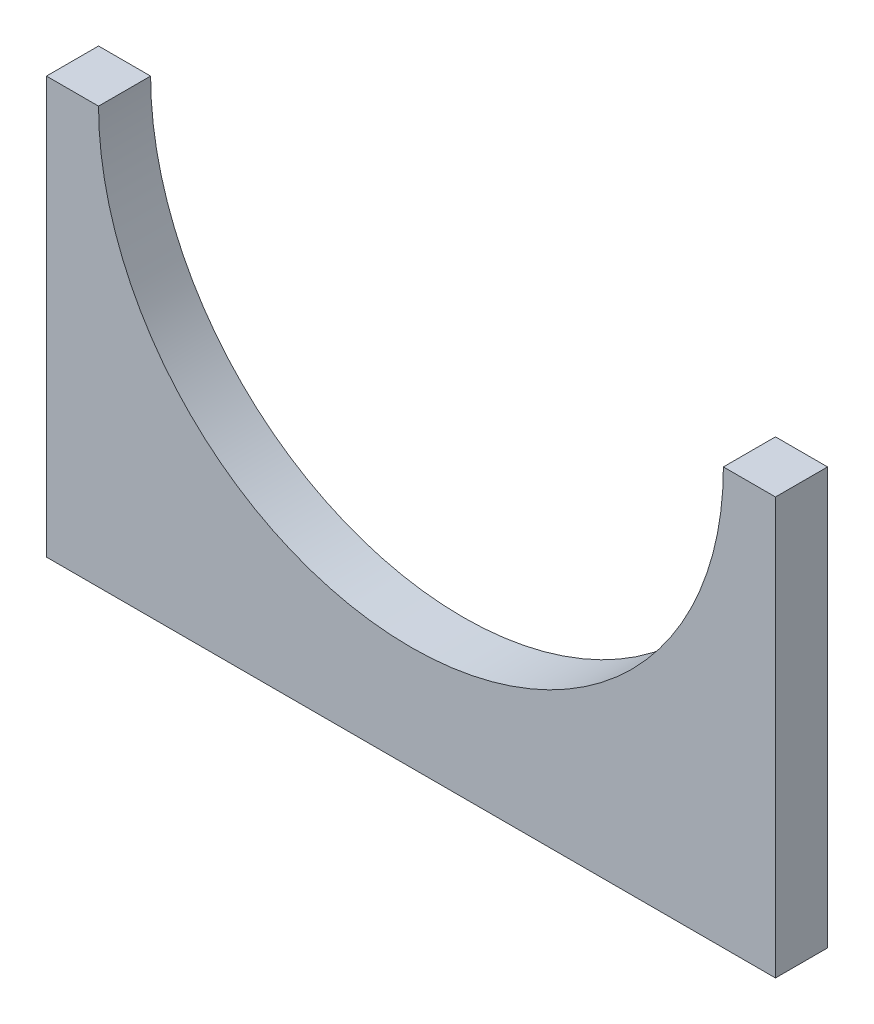
ISO-10303-21;
HEADER;
FILE_DESCRIPTION(('STEP AP214'),'2;1');
FILE_NAME('part.step','',(''),(''),'','','');
FILE_SCHEMA(('AUTOMOTIVE_DESIGN { 1 0 10303 214 1 1 1 1 }'));
ENDSEC;
DATA;
#1=APPLICATION_CONTEXT('core data for automotive mechanical design processes');
#2=APPLICATION_PROTOCOL_DEFINITION('international standard','automotive_design',2000,#1);
#3=PRODUCT_CONTEXT('',#1,'mechanical');
#4=PRODUCT('Part','Part','',(#3));
#5=PRODUCT_RELATED_PRODUCT_CATEGORY('part','',(#4));
#6=PRODUCT_DEFINITION_FORMATION('','',#4);
#7=PRODUCT_DEFINITION_CONTEXT('part definition',#1,'design');
#8=PRODUCT_DEFINITION('design','',#6,#7);
#9=PRODUCT_DEFINITION_SHAPE('','',#8);
#10=(LENGTH_UNIT() NAMED_UNIT(*) SI_UNIT(.MILLI.,.METRE.));
#11=(NAMED_UNIT(*) PLANE_ANGLE_UNIT() SI_UNIT($,.RADIAN.));
#12=(NAMED_UNIT(*) SI_UNIT($,.STERADIAN.) SOLID_ANGLE_UNIT());
#13=UNCERTAINTY_MEASURE_WITH_UNIT(LENGTH_MEASURE(1.E-05),#10,'distance_accuracy_value','');
#14=(GEOMETRIC_REPRESENTATION_CONTEXT(3) GLOBAL_UNCERTAINTY_ASSIGNED_CONTEXT((#13)) GLOBAL_UNIT_ASSIGNED_CONTEXT((#10,
#11,#12)) REPRESENTATION_CONTEXT('',''));
#15=CARTESIAN_POINT('',(0.,0.,0.));
#16=DIRECTION('',(0.,0.,1.));
#17=DIRECTION('',(1.,0.,0.));
#18=AXIS2_PLACEMENT_3D('',#15,#16,#17);
#19=CARTESIAN_POINT('',(-35.,0.,2.5));
#20=DIRECTION('',(0.,-1.,0.));
#21=DIRECTION('',(0.,0.,-1.));
#22=AXIS2_PLACEMENT_3D('',#19,#20,#21);
#23=PLANE('',#22);
#24=DIRECTION('',(-1.,0.,0.));
#25=VECTOR('',#24,1.);
#26=CARTESIAN_POINT('',(-35.,0.,-2.5));
#27=LINE('',#26,#25);
#28=CARTESIAN_POINT('',(-30.,0.,-2.5));
#29=VERTEX_POINT('',#28);
#30=CARTESIAN_POINT('',(-35.,0.,-2.5));
#31=VERTEX_POINT('',#30);
#32=EDGE_CURVE('E117',#29,#31,#27,.T.);
#33=ORIENTED_EDGE('',*,*,#32,.T.);
#34=DIRECTION('',(0.,0.,-1.));
#35=VECTOR('',#34,1.);
#36=CARTESIAN_POINT('',(-35.,0.,2.5));
#37=LINE('',#36,#35);
#38=CARTESIAN_POINT('',(-35.,0.,2.5));
#39=VERTEX_POINT('',#38);
#40=EDGE_CURVE('E11',#39,#31,#37,.T.);
#41=ORIENTED_EDGE('',*,*,#40,.F.);
#42=DIRECTION('',(-1.,0.,0.));
#43=VECTOR('',#42,1.);
#44=CARTESIAN_POINT('',(-35.,0.,2.5));
#45=LINE('',#44,#43);
#46=CARTESIAN_POINT('',(-30.,0.,2.5));
#47=VERTEX_POINT('',#46);
#48=EDGE_CURVE('E127',#47,#39,#45,.T.);
#49=ORIENTED_EDGE('',*,*,#48,.F.);
#50=DIRECTION('',(0.,0.,-1.));
#51=VECTOR('',#50,1.);
#52=CARTESIAN_POINT('',(-30.,0.,2.5));
#53=LINE('',#52,#51);
#54=EDGE_CURVE('E113',#47,#29,#53,.T.);
#55=ORIENTED_EDGE('',*,*,#54,.T.);
#56=EDGE_LOOP('',(#33,#41,#49,#55));
#57=FACE_BOUND('',#56,.T.);
#58=ADVANCED_FACE('F33',(#57),#23,.F.);
#59=CARTESIAN_POINT('',(-35.,0.,2.5));
#60=DIRECTION('',(1.,0.,0.));
#61=DIRECTION('',(0.,1.,0.));
#62=AXIS2_PLACEMENT_3D('',#59,#60,#61);
#63=PLANE('',#62);
#64=DIRECTION('',(0.,-1.,0.));
#65=VECTOR('',#64,1.);
#66=CARTESIAN_POINT('',(-35.,0.,-2.5));
#67=LINE('',#66,#65);
#68=CARTESIAN_POINT('',(-35.,-40.,-2.5));
#69=VERTEX_POINT('',#68);
#70=EDGE_CURVE('E120',#31,#69,#67,.T.);
#71=ORIENTED_EDGE('',*,*,#70,.T.);
#72=DIRECTION('',(0.,0.,-1.));
#73=VECTOR('',#72,1.);
#74=CARTESIAN_POINT('',(-35.,-40.,2.5));
#75=LINE('',#74,#73);
#76=CARTESIAN_POINT('',(-35.,-40.,2.5));
#77=VERTEX_POINT('',#76);
#78=EDGE_CURVE('E41',#77,#69,#75,.T.);
#79=ORIENTED_EDGE('',*,*,#78,.F.);
#80=DIRECTION('',(0.,-1.,0.));
#81=VECTOR('',#80,1.);
#82=CARTESIAN_POINT('',(-35.,0.,2.5));
#83=LINE('',#82,#81);
#84=EDGE_CURVE('E86',#39,#77,#83,.T.);
#85=ORIENTED_EDGE('',*,*,#84,.F.);
#86=ORIENTED_EDGE('',*,*,#40,.T.);
#87=EDGE_LOOP('',(#71,#79,#85,#86));
#88=FACE_BOUND('',#87,.T.);
#89=ADVANCED_FACE('F151',(#88),#63,.F.);
#90=CARTESIAN_POINT('',(-35.,-40.,2.5));
#91=DIRECTION('',(0.,1.,0.));
#92=DIRECTION('',(0.,0.,1.));
#93=AXIS2_PLACEMENT_3D('',#90,#91,#92);
#94=PLANE('',#93);
#95=DIRECTION('',(1.,0.,0.));
#96=VECTOR('',#95,1.);
#97=CARTESIAN_POINT('',(-35.,-40.,-2.5));
#98=LINE('',#97,#96);
#99=CARTESIAN_POINT('',(35.,-40.,-2.5));
#100=VERTEX_POINT('',#99);
#101=EDGE_CURVE('E122',#69,#100,#98,.T.);
#102=ORIENTED_EDGE('',*,*,#101,.T.);
#103=DIRECTION('',(0.,0.,-1.));
#104=VECTOR('',#103,1.);
#105=CARTESIAN_POINT('',(35.,-40.,2.5));
#106=LINE('',#105,#104);
#107=CARTESIAN_POINT('',(35.,-40.,2.5));
#108=VERTEX_POINT('',#107);
#109=EDGE_CURVE('E108',#108,#100,#106,.T.);
#110=ORIENTED_EDGE('',*,*,#109,.F.);
#111=DIRECTION('',(1.,0.,0.));
#112=VECTOR('',#111,1.);
#113=CARTESIAN_POINT('',(-35.,-40.,2.5));
#114=LINE('',#113,#112);
#115=EDGE_CURVE('E99',#77,#108,#114,.T.);
#116=ORIENTED_EDGE('',*,*,#115,.F.);
#117=ORIENTED_EDGE('',*,*,#78,.T.);
#118=EDGE_LOOP('',(#102,#110,#116,#117));
#119=FACE_BOUND('',#118,.T.);
#120=ADVANCED_FACE('F133',(#119),#94,.F.);
#121=CARTESIAN_POINT('',(35.,-40.,2.5));
#122=DIRECTION('',(-1.,0.,0.));
#123=DIRECTION('',(0.,-1.,0.));
#124=AXIS2_PLACEMENT_3D('',#121,#122,#123);
#125=PLANE('',#124);
#126=DIRECTION('',(0.,1.,0.));
#127=VECTOR('',#126,1.);
#128=CARTESIAN_POINT('',(35.,-40.,-2.5));
#129=LINE('',#128,#127);
#130=CARTESIAN_POINT('',(35.,0.,-2.5));
#131=VERTEX_POINT('',#130);
#132=EDGE_CURVE('E107',#100,#131,#129,.T.);
#133=ORIENTED_EDGE('',*,*,#132,.T.);
#134=DIRECTION('',(0.,0.,-1.));
#135=VECTOR('',#134,1.);
#136=CARTESIAN_POINT('',(35.,0.,2.5));
#137=LINE('',#136,#135);
#138=CARTESIAN_POINT('',(35.,0.,2.5));
#139=VERTEX_POINT('',#138);
#140=EDGE_CURVE('E104',#139,#131,#137,.T.);
#141=ORIENTED_EDGE('',*,*,#140,.F.);
#142=DIRECTION('',(0.,1.,0.));
#143=VECTOR('',#142,1.);
#144=CARTESIAN_POINT('',(35.,-40.,2.5));
#145=LINE('',#144,#143);
#146=EDGE_CURVE('E93',#108,#139,#145,.T.);
#147=ORIENTED_EDGE('',*,*,#146,.F.);
#148=ORIENTED_EDGE('',*,*,#109,.T.);
#149=EDGE_LOOP('',(#133,#141,#147,#148));
#150=FACE_BOUND('',#149,.T.);
#151=ADVANCED_FACE('F105',(#150),#125,.F.);
#152=CARTESIAN_POINT('',(30.,0.,2.5));
#153=DIRECTION('',(0.,-1.,0.));
#154=DIRECTION('',(0.,0.,-1.));
#155=AXIS2_PLACEMENT_3D('',#152,#153,#154);
#156=PLANE('',#155);
#157=DIRECTION('',(-1.,0.,0.));
#158=VECTOR('',#157,1.);
#159=CARTESIAN_POINT('',(30.,0.,-2.5));
#160=LINE('',#159,#158);
#161=CARTESIAN_POINT('',(30.,0.,-2.5));
#162=VERTEX_POINT('',#161);
#163=EDGE_CURVE('E72',#131,#162,#160,.T.);
#164=ORIENTED_EDGE('',*,*,#163,.T.);
#165=DIRECTION('',(0.,0.,-1.));
#166=VECTOR('',#165,1.);
#167=CARTESIAN_POINT('',(30.,0.,2.5));
#168=LINE('',#167,#166);
#169=CARTESIAN_POINT('',(30.,0.,2.5));
#170=VERTEX_POINT('',#169);
#171=EDGE_CURVE('E109',#170,#162,#168,.T.);
#172=ORIENTED_EDGE('',*,*,#171,.F.);
#173=DIRECTION('',(-1.,0.,0.));
#174=VECTOR('',#173,1.);
#175=CARTESIAN_POINT('',(30.,0.,2.5));
#176=LINE('',#175,#174);
#177=EDGE_CURVE('E97',#139,#170,#176,.T.);
#178=ORIENTED_EDGE('',*,*,#177,.F.);
#179=ORIENTED_EDGE('',*,*,#140,.T.);
#180=EDGE_LOOP('',(#164,#172,#178,#179));
#181=FACE_BOUND('',#180,.T.);
#182=ADVANCED_FACE('F111',(#181),#156,.F.);
#183=CARTESIAN_POINT('',(0.,0.,2.5));
#184=DIRECTION('',(0.,0.,-1.));
#185=DIRECTION('',(-1.,0.,0.));
#186=AXIS2_PLACEMENT_3D('',#183,#184,#185);
#187=CYLINDRICAL_SURFACE('',#186,30.);
#188=CARTESIAN_POINT('',(0.,0.,-2.5));
#189=DIRECTION('',(0.,0.,-1.));
#190=DIRECTION('',(1.,0.,0.));
#191=AXIS2_PLACEMENT_3D('',#188,#189,#190);
#192=CIRCLE('',#191,30.);
#193=EDGE_CURVE('E78',#162,#29,#192,.T.);
#194=ORIENTED_EDGE('',*,*,#193,.T.);
#195=ORIENTED_EDGE('',*,*,#54,.F.);
#196=CARTESIAN_POINT('',(0.,0.,2.5));
#197=DIRECTION('',(0.,0.,-1.));
#198=DIRECTION('',(1.,0.,0.));
#199=AXIS2_PLACEMENT_3D('',#196,#197,#198);
#200=CIRCLE('',#199,30.);
#201=EDGE_CURVE('E49',#170,#47,#200,.T.);
#202=ORIENTED_EDGE('',*,*,#201,.F.);
#203=ORIENTED_EDGE('',*,*,#171,.T.);
#204=EDGE_LOOP('',(#194,#195,#202,#203));
#205=FACE_BOUND('',#204,.T.);
#206=ADVANCED_FACE('F140',(#205),#187,.F.);
#207=CARTESIAN_POINT('',(0.,0.,2.5));
#208=DIRECTION('',(0.,0.,1.));
#209=DIRECTION('',(1.,0.,0.));
#210=AXIS2_PLACEMENT_3D('',#207,#208,#209);
#211=PLANE('',#210);
#212=ORIENTED_EDGE('',*,*,#48,.T.);
#213=ORIENTED_EDGE('',*,*,#84,.T.);
#214=ORIENTED_EDGE('',*,*,#115,.T.);
#215=ORIENTED_EDGE('',*,*,#146,.T.);
#216=ORIENTED_EDGE('',*,*,#177,.T.);
#217=ORIENTED_EDGE('',*,*,#201,.T.);
#218=EDGE_LOOP('',(#212,#213,#214,#215,#216,#217));
#219=FACE_BOUND('',#218,.T.);
#220=ADVANCED_FACE('F95',(#219),#211,.T.);
#221=CARTESIAN_POINT('',(0.,0.,-2.5));
#222=DIRECTION('',(0.,0.,1.));
#223=DIRECTION('',(1.,0.,0.));
#224=AXIS2_PLACEMENT_3D('',#221,#222,#223);
#225=PLANE('',#224);
#226=ORIENTED_EDGE('',*,*,#32,.F.);
#227=ORIENTED_EDGE('',*,*,#193,.F.);
#228=ORIENTED_EDGE('',*,*,#163,.F.);
#229=ORIENTED_EDGE('',*,*,#132,.F.);
#230=ORIENTED_EDGE('',*,*,#101,.F.);
#231=ORIENTED_EDGE('',*,*,#70,.F.);
#232=EDGE_LOOP('',(#226,#227,#228,#229,#230,#231));
#233=FACE_BOUND('',#232,.T.);
#234=ADVANCED_FACE('F136',(#233),#225,.F.);
#235=CLOSED_SHELL('',(#58,#89,#120,#151,#182,#206,#220,#234));
#236=MANIFOLD_SOLID_BREP('B2',#235);
#237=ADVANCED_BREP_SHAPE_REPRESENTATION('',(#18,#236),#14);
#238=SHAPE_DEFINITION_REPRESENTATION(#9,#237);
ENDSEC;
END-ISO-10303-21;
